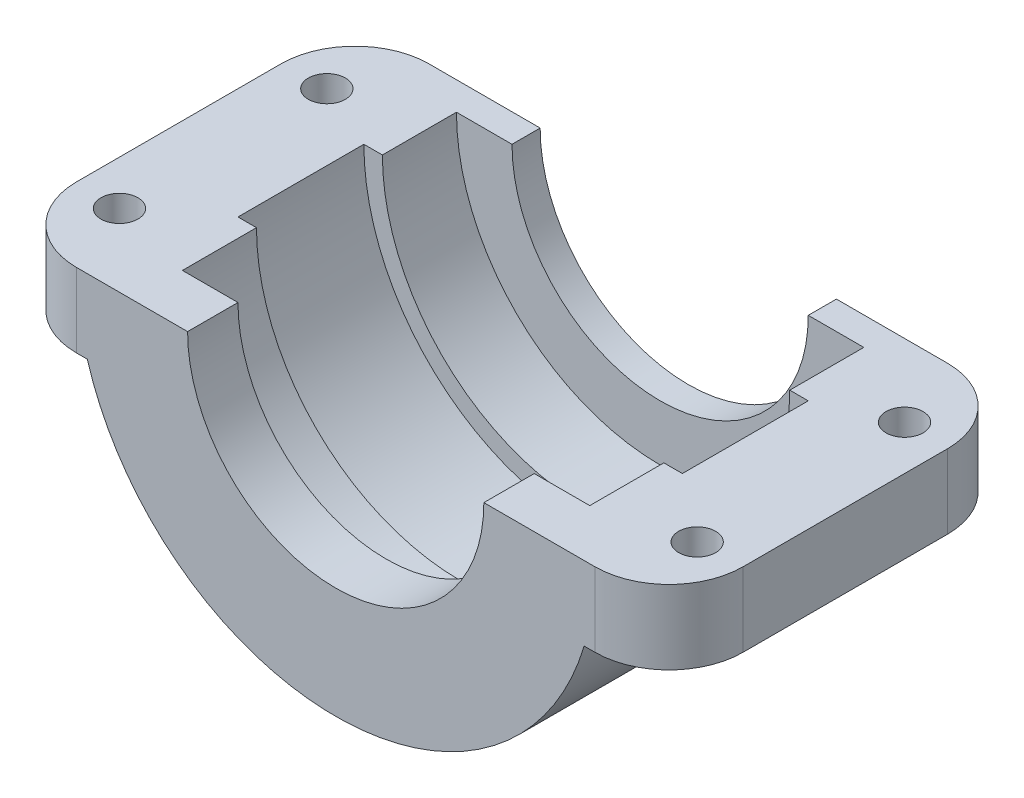
ISO-10303-21;
HEADER;
FILE_DESCRIPTION(('STEP AP214'),'2;1');
FILE_NAME('part.step','',(''),(''),'','','');
FILE_SCHEMA(('AUTOMOTIVE_DESIGN { 1 0 10303 214 1 1 1 1 }'));
ENDSEC;
DATA;
#1=APPLICATION_CONTEXT('core data for automotive mechanical design processes');
#2=APPLICATION_PROTOCOL_DEFINITION('international standard','automotive_design',2000,#1);
#3=PRODUCT_CONTEXT('',#1,'mechanical');
#4=PRODUCT('Part','Part','',(#3));
#5=PRODUCT_RELATED_PRODUCT_CATEGORY('part','',(#4));
#6=PRODUCT_DEFINITION_FORMATION('','',#4);
#7=PRODUCT_DEFINITION_CONTEXT('part definition',#1,'design');
#8=PRODUCT_DEFINITION('design','',#6,#7);
#9=PRODUCT_DEFINITION_SHAPE('','',#8);
#10=(LENGTH_UNIT() NAMED_UNIT(*) SI_UNIT(.MILLI.,.METRE.));
#11=(NAMED_UNIT(*) PLANE_ANGLE_UNIT() SI_UNIT($,.RADIAN.));
#12=(NAMED_UNIT(*) SI_UNIT($,.STERADIAN.) SOLID_ANGLE_UNIT());
#13=UNCERTAINTY_MEASURE_WITH_UNIT(LENGTH_MEASURE(1.E-05),#10,'distance_accuracy_value','');
#14=(GEOMETRIC_REPRESENTATION_CONTEXT(3) GLOBAL_UNCERTAINTY_ASSIGNED_CONTEXT((#13)) GLOBAL_UNIT_ASSIGNED_CONTEXT((#10,
#11,#12)) REPRESENTATION_CONTEXT('',''));
#15=CARTESIAN_POINT('',(0.,0.,0.));
#16=DIRECTION('',(0.,0.,1.));
#17=DIRECTION('',(1.,0.,0.));
#18=AXIS2_PLACEMENT_3D('',#15,#16,#17);
#19=CARTESIAN_POINT('',(0.,0.,3.8));
#20=DIRECTION('',(0.,0.,1.));
#21=DIRECTION('',(1.,0.,0.));
#22=AXIS2_PLACEMENT_3D('',#19,#20,#21);
#23=CYLINDRICAL_SURFACE('',#22,27.5);
#24=CARTESIAN_POINT('',(0.,0.,30.8));
#25=DIRECTION('',(0.,0.,-1.));
#26=DIRECTION('',(-1.,0.,0.));
#27=AXIS2_PLACEMENT_3D('',#24,#25,#26);
#28=CIRCLE('',#27,27.5);
#29=CARTESIAN_POINT('',(-27.5,0.,30.8));
#30=VERTEX_POINT('',#29);
#31=CARTESIAN_POINT('',(27.5,0.,30.8));
#32=VERTEX_POINT('',#31);
#33=EDGE_CURVE('E332',#30,#32,#28,.F.);
#34=ORIENTED_EDGE('',*,*,#33,.F.);
#35=DIRECTION('',(0.,0.,1.));
#36=VECTOR('',#35,1.);
#37=CARTESIAN_POINT('',(-27.5,0.,3.8));
#38=LINE('',#37,#36);
#39=CARTESIAN_POINT('',(-27.5,0.,40.8));
#40=VERTEX_POINT('',#39);
#41=EDGE_CURVE('E189',#40,#30,#38,.F.);
#42=ORIENTED_EDGE('',*,*,#41,.F.);
#43=CARTESIAN_POINT('',(0.,0.,40.8));
#44=DIRECTION('',(0.,0.,1.));
#45=DIRECTION('',(1.,0.,0.));
#46=AXIS2_PLACEMENT_3D('',#43,#44,#45);
#47=CIRCLE('',#46,27.5);
#48=CARTESIAN_POINT('',(27.5,0.,40.8));
#49=VERTEX_POINT('',#48);
#50=EDGE_CURVE('E180',#40,#49,#47,.T.);
#51=ORIENTED_EDGE('',*,*,#50,.T.);
#52=DIRECTION('',(0.,0.,1.));
#53=VECTOR('',#52,1.);
#54=CARTESIAN_POINT('',(27.5,0.,3.8));
#55=LINE('',#54,#53);
#56=EDGE_CURVE('E328',#32,#49,#55,.T.);
#57=ORIENTED_EDGE('',*,*,#56,.F.);
#58=EDGE_LOOP('',(#34,#42,#51,#57));
#59=FACE_BOUND('',#58,.T.);
#60=ADVANCED_FACE('F33',(#59),#23,.F.);
#61=CARTESIAN_POINT('',(-35.,0.,0.));
#62=DIRECTION('',(0.,-1.,0.));
#63=DIRECTION('',(0.,0.,-1.));
#64=AXIS2_PLACEMENT_3D('',#61,#62,#63);
#65=PLANE('',#64);
#66=CARTESIAN_POINT('',(-39.,0.,9.79999999999998));
#67=DIRECTION('',(0.,1.,0.));
#68=DIRECTION('',(0.,0.,-1.));
#69=AXIS2_PLACEMENT_3D('',#66,#67,#68);
#70=CIRCLE('',#69,2.5);
#71=CARTESIAN_POINT('',(-39.,0.,7.29999999999997));
#72=VERTEX_POINT('',#71);
#73=EDGE_CURVE('E217',#72,#72,#70,.T.);
#74=ORIENTED_EDGE('',*,*,#73,.F.);
#75=EDGE_LOOP('',(#74));
#76=FACE_BOUND('',#75,.T.);
#77=CARTESIAN_POINT('',(-39.,0.,37.8));
#78=DIRECTION('',(0.,1.,0.));
#79=DIRECTION('',(0.,0.,1.));
#80=AXIS2_PLACEMENT_3D('',#77,#78,#79);
#81=CIRCLE('',#80,2.5);
#82=CARTESIAN_POINT('',(-39.,0.,40.3));
#83=VERTEX_POINT('',#82);
#84=EDGE_CURVE('E223',#83,#83,#81,.T.);
#85=ORIENTED_EDGE('',*,*,#84,.F.);
#86=EDGE_LOOP('',(#85));
#87=FACE_BOUND('',#86,.T.);
#88=DIRECTION('',(0.,0.,1.));
#89=VECTOR('',#88,1.);
#90=CARTESIAN_POINT('',(-30.,0.,13.8));
#91=LINE('',#90,#89);
#92=CARTESIAN_POINT('',(-30.,0.,13.8));
#93=VERTEX_POINT('',#92);
#94=CARTESIAN_POINT('',(-30.,0.,30.8));
#95=VERTEX_POINT('',#94);
#96=EDGE_CURVE('E172',#93,#95,#91,.T.);
#97=ORIENTED_EDGE('',*,*,#96,.F.);
#98=DIRECTION('',(1.,0.,0.));
#99=VECTOR('',#98,1.);
#100=CARTESIAN_POINT('',(-35.,0.,13.8));
#101=LINE('',#100,#99);
#102=CARTESIAN_POINT('',(-27.5,0.,13.8));
#103=VERTEX_POINT('',#102);
#104=EDGE_CURVE('E181',#93,#103,#101,.T.);
#105=ORIENTED_EDGE('',*,*,#104,.T.);
#106=CARTESIAN_POINT('',(-27.5,0.,3.8));
#107=VERTEX_POINT('',#106);
#108=EDGE_CURVE('E211',#103,#107,#38,.F.);
#109=ORIENTED_EDGE('',*,*,#108,.T.);
#110=DIRECTION('',(-1.,0.,0.));
#111=VECTOR('',#110,1.);
#112=CARTESIAN_POINT('',(-35.,0.,3.8));
#113=LINE('',#112,#111);
#114=CARTESIAN_POINT('',(-20.,0.,3.8));
#115=VERTEX_POINT('',#114);
#116=EDGE_CURVE('E208',#115,#107,#113,.T.);
#117=ORIENTED_EDGE('',*,*,#116,.F.);
#118=DIRECTION('',(0.,0.,-1.));
#119=VECTOR('',#118,1.);
#120=CARTESIAN_POINT('',(-20.,0.,47.6));
#121=LINE('',#120,#119);
#122=CARTESIAN_POINT('',(-20.,0.,0.));
#123=VERTEX_POINT('',#122);
#124=EDGE_CURVE('E284',#115,#123,#121,.T.);
#125=ORIENTED_EDGE('',*,*,#124,.T.);
#126=DIRECTION('',(1.,0.,0.));
#127=VECTOR('',#126,1.);
#128=CARTESIAN_POINT('',(-35.,0.,0.));
#129=LINE('',#128,#127);
#130=CARTESIAN_POINT('',(-35.,0.,0.));
#131=VERTEX_POINT('',#130);
#132=EDGE_CURVE('E260',#131,#123,#129,.T.);
#133=ORIENTED_EDGE('',*,*,#132,.F.);
#134=CARTESIAN_POINT('',(-35.,0.,10.));
#135=DIRECTION('',(0.,-1.,0.));
#136=DIRECTION('',(0.,0.,-1.));
#137=AXIS2_PLACEMENT_3D('',#134,#135,#136);
#138=CIRCLE('',#137,10.);
#139=CARTESIAN_POINT('',(-45.,0.,10.));
#140=VERTEX_POINT('',#139);
#141=EDGE_CURVE('E303',#131,#140,#138,.F.);
#142=ORIENTED_EDGE('',*,*,#141,.T.);
#143=DIRECTION('',(0.,0.,1.));
#144=VECTOR('',#143,1.);
#145=CARTESIAN_POINT('',(-45.,0.,0.));
#146=LINE('',#145,#144);
#147=CARTESIAN_POINT('',(-45.,0.,37.6));
#148=VERTEX_POINT('',#147);
#149=EDGE_CURVE('E242',#140,#148,#146,.T.);
#150=ORIENTED_EDGE('',*,*,#149,.T.);
#151=CARTESIAN_POINT('',(-35.,0.,37.6));
#152=DIRECTION('',(0.,-1.,0.));
#153=DIRECTION('',(0.,0.,-1.));
#154=AXIS2_PLACEMENT_3D('',#151,#152,#153);
#155=CIRCLE('',#154,10.);
#156=CARTESIAN_POINT('',(-35.,0.,47.6));
#157=VERTEX_POINT('',#156);
#158=EDGE_CURVE('E305',#148,#157,#155,.F.);
#159=ORIENTED_EDGE('',*,*,#158,.T.);
#160=DIRECTION('',(1.,0.,0.));
#161=VECTOR('',#160,1.);
#162=CARTESIAN_POINT('',(-35.,0.,47.6));
#163=LINE('',#162,#161);
#164=CARTESIAN_POINT('',(-20.,0.,47.6));
#165=VERTEX_POINT('',#164);
#166=EDGE_CURVE('E265',#157,#165,#163,.T.);
#167=ORIENTED_EDGE('',*,*,#166,.T.);
#168=CARTESIAN_POINT('',(-20.,0.,40.8));
#169=VERTEX_POINT('',#168);
#170=EDGE_CURVE('E285',#165,#169,#121,.T.);
#171=ORIENTED_EDGE('',*,*,#170,.T.);
#172=DIRECTION('',(-1.,0.,0.));
#173=VECTOR('',#172,1.);
#174=CARTESIAN_POINT('',(-35.,0.,40.8));
#175=LINE('',#174,#173);
#176=EDGE_CURVE('E56',#169,#40,#175,.T.);
#177=ORIENTED_EDGE('',*,*,#176,.T.);
#178=ORIENTED_EDGE('',*,*,#41,.T.);
#179=DIRECTION('',(1.,0.,0.));
#180=VECTOR('',#179,1.);
#181=CARTESIAN_POINT('',(-35.,0.,30.8));
#182=LINE('',#181,#180);
#183=EDGE_CURVE('E48',#95,#30,#182,.T.);
#184=ORIENTED_EDGE('',*,*,#183,.F.);
#185=EDGE_LOOP('',(#97,#105,#109,#117,#125,#133,#142,#150,#159,#167,#171,#177,#178,#184));
#186=FACE_BOUND('',#185,.T.);
#187=ADVANCED_FACE('F188',(#76,#87,#186),#65,.F.);
#188=CARTESIAN_POINT('',(39.,0.,9.8));
#189=DIRECTION('',(0.,1.,0.));
#190=DIRECTION('',(0.,0.,1.));
#191=AXIS2_PLACEMENT_3D('',#188,#189,#190);
#192=CIRCLE('',#191,2.5);
#193=CARTESIAN_POINT('',(39.,0.,12.3));
#194=VERTEX_POINT('',#193);
#195=EDGE_CURVE('E231',#194,#194,#192,.T.);
#196=ORIENTED_EDGE('',*,*,#195,.F.);
#197=EDGE_LOOP('',(#196));
#198=FACE_BOUND('',#197,.T.);
#199=CARTESIAN_POINT('',(39.,0.,37.8));
#200=DIRECTION('',(0.,1.,0.));
#201=DIRECTION('',(0.,0.,-1.));
#202=AXIS2_PLACEMENT_3D('',#199,#200,#201);
#203=CIRCLE('',#202,2.5);
#204=CARTESIAN_POINT('',(39.,0.,35.3));
#205=VERTEX_POINT('',#204);
#206=EDGE_CURVE('E227',#205,#205,#203,.T.);
#207=ORIENTED_EDGE('',*,*,#206,.F.);
#208=EDGE_LOOP('',(#207));
#209=FACE_BOUND('',#208,.T.);
#210=CARTESIAN_POINT('',(27.5,0.,3.8));
#211=VERTEX_POINT('',#210);
#212=CARTESIAN_POINT('',(27.5,0.,13.8));
#213=VERTEX_POINT('',#212);
#214=EDGE_CURVE('E329',#211,#213,#55,.T.);
#215=ORIENTED_EDGE('',*,*,#214,.T.);
#216=DIRECTION('',(1.,0.,0.));
#217=VECTOR('',#216,1.);
#218=CARTESIAN_POINT('',(-35.,0.,13.8));
#219=LINE('',#218,#217);
#220=CARTESIAN_POINT('',(30.,0.,13.8));
#221=VERTEX_POINT('',#220);
#222=EDGE_CURVE('E190',#213,#221,#219,.T.);
#223=ORIENTED_EDGE('',*,*,#222,.T.);
#224=DIRECTION('',(0.,0.,1.));
#225=VECTOR('',#224,1.);
#226=CARTESIAN_POINT('',(30.,0.,13.8));
#227=LINE('',#226,#225);
#228=CARTESIAN_POINT('',(30.,0.,30.8));
#229=VERTEX_POINT('',#228);
#230=EDGE_CURVE('E11',#229,#221,#227,.F.);
#231=ORIENTED_EDGE('',*,*,#230,.F.);
#232=DIRECTION('',(1.,0.,0.));
#233=VECTOR('',#232,1.);
#234=CARTESIAN_POINT('',(-35.,0.,30.8));
#235=LINE('',#234,#233);
#236=EDGE_CURVE('E185',#32,#229,#235,.T.);
#237=ORIENTED_EDGE('',*,*,#236,.F.);
#238=ORIENTED_EDGE('',*,*,#56,.T.);
#239=DIRECTION('',(-1.,0.,0.));
#240=VECTOR('',#239,1.);
#241=CARTESIAN_POINT('',(-35.,0.,40.8));
#242=LINE('',#241,#240);
#243=CARTESIAN_POINT('',(20.,0.,40.8));
#244=VERTEX_POINT('',#243);
#245=EDGE_CURVE('E200',#49,#244,#242,.T.);
#246=ORIENTED_EDGE('',*,*,#245,.T.);
#247=DIRECTION('',(0.,0.,-1.));
#248=VECTOR('',#247,1.);
#249=CARTESIAN_POINT('',(20.,0.,47.6));
#250=LINE('',#249,#248);
#251=CARTESIAN_POINT('',(20.,0.,47.6));
#252=VERTEX_POINT('',#251);
#253=EDGE_CURVE('E270',#244,#252,#250,.F.);
#254=ORIENTED_EDGE('',*,*,#253,.T.);
#255=CARTESIAN_POINT('',(35.,0.,47.6));
#256=VERTEX_POINT('',#255);
#257=EDGE_CURVE('E259',#252,#256,#163,.T.);
#258=ORIENTED_EDGE('',*,*,#257,.T.);
#259=CARTESIAN_POINT('',(35.,0.,37.6));
#260=DIRECTION('',(0.,-1.,0.));
#261=DIRECTION('',(0.,0.,-1.));
#262=AXIS2_PLACEMENT_3D('',#259,#260,#261);
#263=CIRCLE('',#262,10.);
#264=CARTESIAN_POINT('',(45.,0.,37.6));
#265=VERTEX_POINT('',#264);
#266=EDGE_CURVE('E313',#256,#265,#263,.F.);
#267=ORIENTED_EDGE('',*,*,#266,.T.);
#268=DIRECTION('',(0.,0.,1.));
#269=VECTOR('',#268,1.);
#270=CARTESIAN_POINT('',(45.,0.,0.));
#271=LINE('',#270,#269);
#272=CARTESIAN_POINT('',(45.,0.,10.));
#273=VERTEX_POINT('',#272);
#274=EDGE_CURVE('E246',#273,#265,#271,.T.);
#275=ORIENTED_EDGE('',*,*,#274,.F.);
#276=CARTESIAN_POINT('',(35.,0.,10.));
#277=DIRECTION('',(0.,-1.,0.));
#278=DIRECTION('',(0.,0.,-1.));
#279=AXIS2_PLACEMENT_3D('',#276,#277,#278);
#280=CIRCLE('',#279,10.);
#281=CARTESIAN_POINT('',(35.,0.,0.));
#282=VERTEX_POINT('',#281);
#283=EDGE_CURVE('E311',#273,#282,#280,.F.);
#284=ORIENTED_EDGE('',*,*,#283,.T.);
#285=CARTESIAN_POINT('',(20.,0.,0.));
#286=VERTEX_POINT('',#285);
#287=EDGE_CURVE('E264',#286,#282,#129,.T.);
#288=ORIENTED_EDGE('',*,*,#287,.F.);
#289=CARTESIAN_POINT('',(20.,0.,3.8));
#290=VERTEX_POINT('',#289);
#291=EDGE_CURVE('E281',#286,#290,#250,.F.);
#292=ORIENTED_EDGE('',*,*,#291,.T.);
#293=DIRECTION('',(-1.,0.,0.));
#294=VECTOR('',#293,1.);
#295=CARTESIAN_POINT('',(-35.,0.,3.8));
#296=LINE('',#295,#294);
#297=EDGE_CURVE('E206',#211,#290,#296,.T.);
#298=ORIENTED_EDGE('',*,*,#297,.F.);
#299=EDGE_LOOP('',(#215,#223,#231,#237,#238,#246,#254,#258,#267,#275,#284,#288,#292,#298));
#300=FACE_BOUND('',#299,.T.);
#301=ADVANCED_FACE('F341',(#198,#209,#300),#65,.F.);
#302=CARTESIAN_POINT('',(0.,0.,47.6));
#303=DIRECTION('',(0.,0.,-1.));
#304=DIRECTION('',(-1.,0.,0.));
#305=AXIS2_PLACEMENT_3D('',#302,#303,#304);
#306=CYLINDRICAL_SURFACE('',#305,20.);
#307=CARTESIAN_POINT('',(0.,0.,3.8));
#308=DIRECTION('',(0.,0.,1.));
#309=DIRECTION('',(1.,0.,0.));
#310=AXIS2_PLACEMENT_3D('',#307,#308,#309);
#311=CIRCLE('',#310,20.);
#312=EDGE_CURVE('E326',#290,#115,#311,.F.);
#313=ORIENTED_EDGE('',*,*,#312,.F.);
#314=ORIENTED_EDGE('',*,*,#291,.F.);
#315=CARTESIAN_POINT('',(0.,0.,0.));
#316=DIRECTION('',(0.,0.,-1.));
#317=DIRECTION('',(-1.,0.,0.));
#318=AXIS2_PLACEMENT_3D('',#315,#316,#317);
#319=CIRCLE('',#318,20.);
#320=EDGE_CURVE('E213',#286,#123,#319,.T.);
#321=ORIENTED_EDGE('',*,*,#320,.T.);
#322=ORIENTED_EDGE('',*,*,#124,.F.);
#323=EDGE_LOOP('',(#313,#314,#321,#322));
#324=FACE_BOUND('',#323,.T.);
#325=ADVANCED_FACE('F349',(#324),#306,.F.);
#326=CARTESIAN_POINT('',(0.,0.,47.6));
#327=DIRECTION('',(0.,0.,-1.));
#328=DIRECTION('',(-1.,0.,0.));
#329=AXIS2_PLACEMENT_3D('',#326,#327,#328);
#330=CYLINDRICAL_SURFACE('',#329,35.);
#331=CARTESIAN_POINT('',(0.,0.,47.6));
#332=DIRECTION('',(0.,0.,1.));
#333=DIRECTION('',(1.,0.,0.));
#334=AXIS2_PLACEMENT_3D('',#331,#332,#333);
#335=CIRCLE('',#334,35.);
#336=CARTESIAN_POINT('',(-33.5410196624969,-10.,47.6));
#337=VERTEX_POINT('',#336);
#338=CARTESIAN_POINT('',(33.5410196624968,-10.,47.6));
#339=VERTEX_POINT('',#338);
#340=EDGE_CURVE('E267',#337,#339,#335,.T.);
#341=ORIENTED_EDGE('',*,*,#340,.F.);
#342=DIRECTION('',(0.,0.,-1.));
#343=VECTOR('',#342,1.);
#344=CARTESIAN_POINT('',(-33.5410196624969,-9.99999999999999,47.6));
#345=LINE('',#344,#343);
#346=CARTESIAN_POINT('',(-33.5410196624969,-10.,0.));
#347=VERTEX_POINT('',#346);
#348=EDGE_CURVE('E256',#337,#347,#345,.T.);
#349=ORIENTED_EDGE('',*,*,#348,.T.);
#350=CARTESIAN_POINT('',(0.,0.,0.));
#351=DIRECTION('',(0.,0.,1.));
#352=DIRECTION('',(1.,0.,0.));
#353=AXIS2_PLACEMENT_3D('',#350,#351,#352);
#354=CIRCLE('',#353,35.);
#355=CARTESIAN_POINT('',(33.5410196624968,-10.,0.));
#356=VERTEX_POINT('',#355);
#357=EDGE_CURVE('E263',#347,#356,#354,.T.);
#358=ORIENTED_EDGE('',*,*,#357,.T.);
#359=DIRECTION('',(0.,0.,-1.));
#360=VECTOR('',#359,1.);
#361=CARTESIAN_POINT('',(33.5410196624969,-9.99999999999999,47.6));
#362=LINE('',#361,#360);
#363=EDGE_CURVE('E245',#356,#339,#362,.F.);
#364=ORIENTED_EDGE('',*,*,#363,.T.);
#365=EDGE_LOOP('',(#341,#349,#358,#364));
#366=FACE_BOUND('',#365,.T.);
#367=ADVANCED_FACE('F425',(#366),#330,.T.);
#368=CARTESIAN_POINT('',(0.,0.,47.6));
#369=DIRECTION('',(0.,0.,1.));
#370=DIRECTION('',(1.,0.,0.));
#371=AXIS2_PLACEMENT_3D('',#368,#369,#370);
#372=PLANE('',#371);
#373=ORIENTED_EDGE('',*,*,#166,.F.);
#374=DIRECTION('',(0.,-1.,0.));
#375=VECTOR('',#374,1.);
#376=CARTESIAN_POINT('',(-35.,0.,47.6));
#377=LINE('',#376,#375);
#378=CARTESIAN_POINT('',(-35.,-10.,47.6));
#379=VERTEX_POINT('',#378);
#380=EDGE_CURVE('E291',#157,#379,#377,.T.);
#381=ORIENTED_EDGE('',*,*,#380,.T.);
#382=DIRECTION('',(1.,0.,0.));
#383=VECTOR('',#382,1.);
#384=CARTESIAN_POINT('',(-45.,-10.,47.6));
#385=LINE('',#384,#383);
#386=EDGE_CURVE('E239',#379,#337,#385,.T.);
#387=ORIENTED_EDGE('',*,*,#386,.T.);
#388=ORIENTED_EDGE('',*,*,#340,.T.);
#389=CARTESIAN_POINT('',(35.,-10.,47.6));
#390=VERTEX_POINT('',#389);
#391=EDGE_CURVE('E241',#339,#390,#385,.T.);
#392=ORIENTED_EDGE('',*,*,#391,.T.);
#393=DIRECTION('',(0.,1.,0.));
#394=VECTOR('',#393,1.);
#395=CARTESIAN_POINT('',(35.,0.,47.6));
#396=LINE('',#395,#394);
#397=EDGE_CURVE('E288',#390,#256,#396,.T.);
#398=ORIENTED_EDGE('',*,*,#397,.T.);
#399=ORIENTED_EDGE('',*,*,#257,.F.);
#400=CARTESIAN_POINT('',(0.,0.,47.6));
#401=DIRECTION('',(0.,0.,-1.));
#402=DIRECTION('',(-1.,0.,0.));
#403=AXIS2_PLACEMENT_3D('',#400,#401,#402);
#404=CIRCLE('',#403,20.);
#405=EDGE_CURVE('E214',#252,#165,#404,.T.);
#406=ORIENTED_EDGE('',*,*,#405,.T.);
#407=EDGE_LOOP('',(#373,#381,#387,#388,#392,#398,#399,#406));
#408=FACE_BOUND('',#407,.T.);
#409=ADVANCED_FACE('F374',(#408),#372,.T.);
#410=CARTESIAN_POINT('',(0.,0.,0.));
#411=DIRECTION('',(0.,0.,1.));
#412=DIRECTION('',(1.,0.,0.));
#413=AXIS2_PLACEMENT_3D('',#410,#411,#412);
#414=PLANE('',#413);
#415=DIRECTION('',(1.,0.,0.));
#416=VECTOR('',#415,1.);
#417=CARTESIAN_POINT('',(-45.,-10.,0.));
#418=LINE('',#417,#416);
#419=CARTESIAN_POINT('',(-35.,-10.,0.));
#420=VERTEX_POINT('',#419);
#421=EDGE_CURVE('E235',#420,#347,#418,.T.);
#422=ORIENTED_EDGE('',*,*,#421,.F.);
#423=DIRECTION('',(0.,-1.,0.));
#424=VECTOR('',#423,1.);
#425=CARTESIAN_POINT('',(-35.,0.,0.));
#426=LINE('',#425,#424);
#427=EDGE_CURVE('E309',#420,#131,#426,.F.);
#428=ORIENTED_EDGE('',*,*,#427,.T.);
#429=ORIENTED_EDGE('',*,*,#132,.T.);
#430=ORIENTED_EDGE('',*,*,#320,.F.);
#431=ORIENTED_EDGE('',*,*,#287,.T.);
#432=DIRECTION('',(0.,1.,0.));
#433=VECTOR('',#432,1.);
#434=CARTESIAN_POINT('',(35.,-10.,0.));
#435=LINE('',#434,#433);
#436=CARTESIAN_POINT('',(35.,-10.,0.));
#437=VERTEX_POINT('',#436);
#438=EDGE_CURVE('E307',#282,#437,#435,.F.);
#439=ORIENTED_EDGE('',*,*,#438,.T.);
#440=EDGE_CURVE('E238',#356,#437,#418,.T.);
#441=ORIENTED_EDGE('',*,*,#440,.F.);
#442=ORIENTED_EDGE('',*,*,#357,.F.);
#443=EDGE_LOOP('',(#422,#428,#429,#430,#431,#439,#441,#442));
#444=FACE_BOUND('',#443,.T.);
#445=ADVANCED_FACE('F355',(#444),#414,.F.);
#446=CARTESIAN_POINT('',(45.,0.,0.));
#447=DIRECTION('',(1.,0.,0.));
#448=DIRECTION('',(0.,0.,-1.));
#449=AXIS2_PLACEMENT_3D('',#446,#447,#448);
#450=PLANE('',#449);
#451=ORIENTED_EDGE('',*,*,#274,.T.);
#452=DIRECTION('',(0.,1.,0.));
#453=VECTOR('',#452,1.);
#454=CARTESIAN_POINT('',(45.,0.,37.6));
#455=LINE('',#454,#453);
#456=CARTESIAN_POINT('',(45.,-10.,37.6));
#457=VERTEX_POINT('',#456);
#458=EDGE_CURVE('E318',#265,#457,#455,.F.);
#459=ORIENTED_EDGE('',*,*,#458,.T.);
#460=DIRECTION('',(0.,0.,1.));
#461=VECTOR('',#460,1.);
#462=CARTESIAN_POINT('',(45.,-10.,0.));
#463=LINE('',#462,#461);
#464=CARTESIAN_POINT('',(45.,-10.,10.));
#465=VERTEX_POINT('',#464);
#466=EDGE_CURVE('E249',#465,#457,#463,.T.);
#467=ORIENTED_EDGE('',*,*,#466,.F.);
#468=DIRECTION('',(0.,1.,0.));
#469=VECTOR('',#468,1.);
#470=CARTESIAN_POINT('',(45.,0.,10.));
#471=LINE('',#470,#469);
#472=EDGE_CURVE('E315',#465,#273,#471,.T.);
#473=ORIENTED_EDGE('',*,*,#472,.T.);
#474=EDGE_LOOP('',(#451,#459,#467,#473));
#475=FACE_BOUND('',#474,.T.);
#476=ADVANCED_FACE('F417',(#475),#450,.T.);
#477=CARTESIAN_POINT('',(-45.,-10.,0.));
#478=DIRECTION('',(0.,-1.,0.));
#479=DIRECTION('',(0.,0.,-1.));
#480=AXIS2_PLACEMENT_3D('',#477,#478,#479);
#481=PLANE('',#480);
#482=CARTESIAN_POINT('',(39.,-10.,37.8));
#483=DIRECTION('',(0.,-1.,0.));
#484=DIRECTION('',(0.,0.,-1.));
#485=AXIS2_PLACEMENT_3D('',#482,#483,#484);
#486=CIRCLE('',#485,2.5);
#487=CARTESIAN_POINT('',(39.,-10.,35.3));
#488=VERTEX_POINT('',#487);
#489=EDGE_CURVE('E230',#488,#488,#486,.T.);
#490=ORIENTED_EDGE('',*,*,#489,.F.);
#491=EDGE_LOOP('',(#490));
#492=FACE_BOUND('',#491,.T.);
#493=CARTESIAN_POINT('',(39.,-10.,9.8));
#494=DIRECTION('',(0.,-1.,0.));
#495=DIRECTION('',(0.,0.,-1.));
#496=AXIS2_PLACEMENT_3D('',#493,#494,#495);
#497=CIRCLE('',#496,2.5);
#498=CARTESIAN_POINT('',(39.,-10.,7.3));
#499=VERTEX_POINT('',#498);
#500=EDGE_CURVE('E234',#499,#499,#497,.T.);
#501=ORIENTED_EDGE('',*,*,#500,.F.);
#502=EDGE_LOOP('',(#501));
#503=FACE_BOUND('',#502,.T.);
#504=ORIENTED_EDGE('',*,*,#466,.T.);
#505=CARTESIAN_POINT('',(35.,-10.,37.6));
#506=DIRECTION('',(0.,-1.,0.));
#507=DIRECTION('',(0.,0.,-1.));
#508=AXIS2_PLACEMENT_3D('',#505,#506,#507);
#509=CIRCLE('',#508,10.);
#510=EDGE_CURVE('E322',#457,#390,#509,.T.);
#511=ORIENTED_EDGE('',*,*,#510,.T.);
#512=ORIENTED_EDGE('',*,*,#391,.F.);
#513=ORIENTED_EDGE('',*,*,#363,.F.);
#514=ORIENTED_EDGE('',*,*,#440,.T.);
#515=CARTESIAN_POINT('',(35.,-10.,10.));
#516=DIRECTION('',(0.,-1.,0.));
#517=DIRECTION('',(0.,0.,-1.));
#518=AXIS2_PLACEMENT_3D('',#515,#516,#517);
#519=CIRCLE('',#518,10.);
#520=EDGE_CURVE('E320',#437,#465,#519,.T.);
#521=ORIENTED_EDGE('',*,*,#520,.T.);
#522=EDGE_LOOP('',(#504,#511,#512,#513,#514,#521));
#523=FACE_BOUND('',#522,.T.);
#524=ADVANCED_FACE('F413',(#492,#503,#523),#481,.T.);
#525=CARTESIAN_POINT('',(-39.,-10.,9.79999999999998));
#526=DIRECTION('',(0.,-1.,0.));
#527=DIRECTION('',(0.,0.,-1.));
#528=AXIS2_PLACEMENT_3D('',#525,#526,#527);
#529=CIRCLE('',#528,2.5);
#530=CARTESIAN_POINT('',(-39.,-10.,7.29999999999997));
#531=VERTEX_POINT('',#530);
#532=EDGE_CURVE('E222',#531,#531,#529,.T.);
#533=ORIENTED_EDGE('',*,*,#532,.F.);
#534=EDGE_LOOP('',(#533));
#535=FACE_BOUND('',#534,.T.);
#536=CARTESIAN_POINT('',(-39.,-10.,37.8));
#537=DIRECTION('',(0.,-1.,0.));
#538=DIRECTION('',(0.,0.,-1.));
#539=AXIS2_PLACEMENT_3D('',#536,#537,#538);
#540=CIRCLE('',#539,2.5);
#541=CARTESIAN_POINT('',(-39.,-10.,35.3));
#542=VERTEX_POINT('',#541);
#543=EDGE_CURVE('E226',#542,#542,#540,.T.);
#544=ORIENTED_EDGE('',*,*,#543,.F.);
#545=EDGE_LOOP('',(#544));
#546=FACE_BOUND('',#545,.T.);
#547=ORIENTED_EDGE('',*,*,#386,.F.);
#548=CARTESIAN_POINT('',(-35.,-10.,37.6));
#549=DIRECTION('',(0.,-1.,0.));
#550=DIRECTION('',(0.,0.,-1.));
#551=AXIS2_PLACEMENT_3D('',#548,#549,#550);
#552=CIRCLE('',#551,10.);
#553=CARTESIAN_POINT('',(-45.,-10.,37.6));
#554=VERTEX_POINT('',#553);
#555=EDGE_CURVE('E296',#379,#554,#552,.T.);
#556=ORIENTED_EDGE('',*,*,#555,.T.);
#557=DIRECTION('',(0.,0.,1.));
#558=VECTOR('',#557,1.);
#559=CARTESIAN_POINT('',(-45.,-10.,0.));
#560=LINE('',#559,#558);
#561=CARTESIAN_POINT('',(-45.,-10.,10.));
#562=VERTEX_POINT('',#561);
#563=EDGE_CURVE('E237',#562,#554,#560,.T.);
#564=ORIENTED_EDGE('',*,*,#563,.F.);
#565=CARTESIAN_POINT('',(-35.,-10.,10.));
#566=DIRECTION('',(0.,-1.,0.));
#567=DIRECTION('',(0.,0.,-1.));
#568=AXIS2_PLACEMENT_3D('',#565,#566,#567);
#569=CIRCLE('',#568,10.);
#570=EDGE_CURVE('E294',#562,#420,#569,.T.);
#571=ORIENTED_EDGE('',*,*,#570,.T.);
#572=ORIENTED_EDGE('',*,*,#421,.T.);
#573=ORIENTED_EDGE('',*,*,#348,.F.);
#574=EDGE_LOOP('',(#547,#556,#564,#571,#572,#573));
#575=FACE_BOUND('',#574,.T.);
#576=ADVANCED_FACE('F427',(#535,#546,#575),#481,.T.);
#577=CARTESIAN_POINT('',(-45.,0.,0.));
#578=DIRECTION('',(-1.,0.,0.));
#579=DIRECTION('',(0.,0.,1.));
#580=AXIS2_PLACEMENT_3D('',#577,#578,#579);
#581=PLANE('',#580);
#582=ORIENTED_EDGE('',*,*,#563,.T.);
#583=DIRECTION('',(0.,-1.,0.));
#584=VECTOR('',#583,1.);
#585=CARTESIAN_POINT('',(-45.,0.,37.6));
#586=LINE('',#585,#584);
#587=EDGE_CURVE('E301',#554,#148,#586,.F.);
#588=ORIENTED_EDGE('',*,*,#587,.T.);
#589=ORIENTED_EDGE('',*,*,#149,.F.);
#590=DIRECTION('',(0.,-1.,0.));
#591=VECTOR('',#590,1.);
#592=CARTESIAN_POINT('',(-45.,-10.,10.));
#593=LINE('',#592,#591);
#594=EDGE_CURVE('E298',#140,#562,#593,.T.);
#595=ORIENTED_EDGE('',*,*,#594,.T.);
#596=EDGE_LOOP('',(#582,#588,#589,#595));
#597=FACE_BOUND('',#596,.T.);
#598=ADVANCED_FACE('F365',(#597),#581,.T.);
#599=CARTESIAN_POINT('',(39.,-35.,9.8));
#600=DIRECTION('',(0.,1.,0.));
#601=DIRECTION('',(0.,0.,1.));
#602=AXIS2_PLACEMENT_3D('',#599,#600,#601);
#603=CYLINDRICAL_SURFACE('',#602,2.5);
#604=ORIENTED_EDGE('',*,*,#500,.T.);
#605=EDGE_LOOP('',(#604));
#606=FACE_BOUND('',#605,.T.);
#607=ORIENTED_EDGE('',*,*,#195,.T.);
#608=EDGE_LOOP('',(#607));
#609=FACE_BOUND('',#608,.T.);
#610=ADVANCED_FACE('F435',(#606,#609),#603,.F.);
#611=CARTESIAN_POINT('',(39.,-35.,37.8));
#612=DIRECTION('',(0.,1.,0.));
#613=DIRECTION('',(0.,0.,1.));
#614=AXIS2_PLACEMENT_3D('',#611,#612,#613);
#615=CYLINDRICAL_SURFACE('',#614,2.5);
#616=ORIENTED_EDGE('',*,*,#489,.T.);
#617=EDGE_LOOP('',(#616));
#618=FACE_BOUND('',#617,.T.);
#619=ORIENTED_EDGE('',*,*,#206,.T.);
#620=EDGE_LOOP('',(#619));
#621=FACE_BOUND('',#620,.T.);
#622=ADVANCED_FACE('F557',(#618,#621),#615,.F.);
#623=CARTESIAN_POINT('',(-39.,-35.,37.8));
#624=DIRECTION('',(0.,1.,0.));
#625=DIRECTION('',(0.,0.,1.));
#626=AXIS2_PLACEMENT_3D('',#623,#624,#625);
#627=CYLINDRICAL_SURFACE('',#626,2.5);
#628=ORIENTED_EDGE('',*,*,#543,.T.);
#629=EDGE_LOOP('',(#628));
#630=FACE_BOUND('',#629,.T.);
#631=ORIENTED_EDGE('',*,*,#84,.T.);
#632=EDGE_LOOP('',(#631));
#633=FACE_BOUND('',#632,.T.);
#634=ADVANCED_FACE('F559',(#630,#633),#627,.F.);
#635=CARTESIAN_POINT('',(-39.,-35.,9.79999999999998));
#636=DIRECTION('',(0.,1.,0.));
#637=DIRECTION('',(0.,0.,1.));
#638=AXIS2_PLACEMENT_3D('',#635,#636,#637);
#639=CYLINDRICAL_SURFACE('',#638,2.5);
#640=ORIENTED_EDGE('',*,*,#532,.T.);
#641=EDGE_LOOP('',(#640));
#642=FACE_BOUND('',#641,.T.);
#643=ORIENTED_EDGE('',*,*,#73,.T.);
#644=EDGE_LOOP('',(#643));
#645=FACE_BOUND('',#644,.T.);
#646=ADVANCED_FACE('F482',(#642,#645),#639,.F.);
#647=ORIENTED_EDGE('',*,*,#253,.F.);
#648=CARTESIAN_POINT('',(0.,0.,40.8));
#649=DIRECTION('',(0.,0.,1.));
#650=DIRECTION('',(1.,0.,0.));
#651=AXIS2_PLACEMENT_3D('',#648,#649,#650);
#652=CIRCLE('',#651,20.);
#653=EDGE_CURVE('E324',#244,#169,#652,.F.);
#654=ORIENTED_EDGE('',*,*,#653,.T.);
#655=ORIENTED_EDGE('',*,*,#170,.F.);
#656=ORIENTED_EDGE('',*,*,#405,.F.);
#657=EDGE_LOOP('',(#647,#654,#655,#656));
#658=FACE_BOUND('',#657,.T.);
#659=ADVANCED_FACE('F381',(#658),#306,.F.);
#660=CARTESIAN_POINT('',(-35.,0.,37.6));
#661=DIRECTION('',(0.,-1.,0.));
#662=DIRECTION('',(0.,0.,-1.));
#663=AXIS2_PLACEMENT_3D('',#660,#661,#662);
#664=CYLINDRICAL_SURFACE('',#663,10.);
#665=ORIENTED_EDGE('',*,*,#158,.F.);
#666=ORIENTED_EDGE('',*,*,#587,.F.);
#667=ORIENTED_EDGE('',*,*,#555,.F.);
#668=ORIENTED_EDGE('',*,*,#380,.F.);
#669=EDGE_LOOP('',(#665,#666,#667,#668));
#670=FACE_BOUND('',#669,.T.);
#671=ADVANCED_FACE('F369',(#670),#664,.T.);
#672=CARTESIAN_POINT('',(-35.,0.,10.));
#673=DIRECTION('',(0.,1.,0.));
#674=DIRECTION('',(0.,0.,1.));
#675=AXIS2_PLACEMENT_3D('',#672,#673,#674);
#676=CYLINDRICAL_SURFACE('',#675,10.);
#677=ORIENTED_EDGE('',*,*,#141,.F.);
#678=ORIENTED_EDGE('',*,*,#427,.F.);
#679=ORIENTED_EDGE('',*,*,#570,.F.);
#680=ORIENTED_EDGE('',*,*,#594,.F.);
#681=EDGE_LOOP('',(#677,#678,#679,#680));
#682=FACE_BOUND('',#681,.T.);
#683=ADVANCED_FACE('F360',(#682),#676,.T.);
#684=CARTESIAN_POINT('',(35.,0.,37.6));
#685=DIRECTION('',(0.,1.,0.));
#686=DIRECTION('',(0.,0.,1.));
#687=AXIS2_PLACEMENT_3D('',#684,#685,#686);
#688=CYLINDRICAL_SURFACE('',#687,10.);
#689=ORIENTED_EDGE('',*,*,#510,.F.);
#690=ORIENTED_EDGE('',*,*,#458,.F.);
#691=ORIENTED_EDGE('',*,*,#266,.F.);
#692=ORIENTED_EDGE('',*,*,#397,.F.);
#693=EDGE_LOOP('',(#689,#690,#691,#692));
#694=FACE_BOUND('',#693,.T.);
#695=ADVANCED_FACE('F401',(#694),#688,.T.);
#696=CARTESIAN_POINT('',(35.,0.,10.));
#697=DIRECTION('',(0.,-1.,0.));
#698=DIRECTION('',(0.,0.,-1.));
#699=AXIS2_PLACEMENT_3D('',#696,#697,#698);
#700=CYLINDRICAL_SURFACE('',#699,10.);
#701=ORIENTED_EDGE('',*,*,#520,.F.);
#702=ORIENTED_EDGE('',*,*,#438,.F.);
#703=ORIENTED_EDGE('',*,*,#283,.F.);
#704=ORIENTED_EDGE('',*,*,#472,.F.);
#705=EDGE_LOOP('',(#701,#702,#703,#704));
#706=FACE_BOUND('',#705,.T.);
#707=ADVANCED_FACE('F35',(#706),#700,.T.);
#708=ORIENTED_EDGE('',*,*,#108,.F.);
#709=CARTESIAN_POINT('',(0.,0.,13.8));
#710=DIRECTION('',(0.,0.,-1.));
#711=DIRECTION('',(-1.,0.,0.));
#712=AXIS2_PLACEMENT_3D('',#709,#710,#711);
#713=CIRCLE('',#712,27.5);
#714=EDGE_CURVE('E41',#103,#213,#713,.F.);
#715=ORIENTED_EDGE('',*,*,#714,.T.);
#716=ORIENTED_EDGE('',*,*,#214,.F.);
#717=CARTESIAN_POINT('',(0.,0.,3.8));
#718=DIRECTION('',(0.,0.,1.));
#719=DIRECTION('',(1.,0.,0.));
#720=AXIS2_PLACEMENT_3D('',#717,#718,#719);
#721=CIRCLE('',#720,27.5);
#722=EDGE_CURVE('E197',#107,#211,#721,.T.);
#723=ORIENTED_EDGE('',*,*,#722,.F.);
#724=EDGE_LOOP('',(#708,#715,#716,#723));
#725=FACE_BOUND('',#724,.T.);
#726=ADVANCED_FACE('F336',(#725),#23,.F.);
#727=CARTESIAN_POINT('',(0.,0.,3.8));
#728=DIRECTION('',(0.,0.,1.));
#729=DIRECTION('',(1.,0.,0.));
#730=AXIS2_PLACEMENT_3D('',#727,#728,#729);
#731=PLANE('',#730);
#732=ORIENTED_EDGE('',*,*,#116,.T.);
#733=ORIENTED_EDGE('',*,*,#722,.T.);
#734=ORIENTED_EDGE('',*,*,#297,.T.);
#735=ORIENTED_EDGE('',*,*,#312,.T.);
#736=EDGE_LOOP('',(#732,#733,#734,#735));
#737=FACE_BOUND('',#736,.T.);
#738=ADVANCED_FACE('F345',(#737),#731,.T.);
#739=CARTESIAN_POINT('',(0.,0.,40.8));
#740=DIRECTION('',(0.,0.,1.));
#741=DIRECTION('',(1.,0.,0.));
#742=AXIS2_PLACEMENT_3D('',#739,#740,#741);
#743=PLANE('',#742);
#744=ORIENTED_EDGE('',*,*,#653,.F.);
#745=ORIENTED_EDGE('',*,*,#245,.F.);
#746=ORIENTED_EDGE('',*,*,#50,.F.);
#747=ORIENTED_EDGE('',*,*,#176,.F.);
#748=EDGE_LOOP('',(#744,#745,#746,#747));
#749=FACE_BOUND('',#748,.T.);
#750=ADVANCED_FACE('F383',(#749),#743,.F.);
#751=CARTESIAN_POINT('',(0.,0.,13.8));
#752=DIRECTION('',(0.,0.,1.));
#753=DIRECTION('',(1.,0.,0.));
#754=AXIS2_PLACEMENT_3D('',#751,#752,#753);
#755=CYLINDRICAL_SURFACE('',#754,30.);
#756=ORIENTED_EDGE('',*,*,#96,.T.);
#757=CARTESIAN_POINT('',(0.,0.,30.8));
#758=DIRECTION('',(0.,0.,-1.));
#759=DIRECTION('',(-1.,0.,0.));
#760=AXIS2_PLACEMENT_3D('',#757,#758,#759);
#761=CIRCLE('',#760,30.);
#762=EDGE_CURVE('E174',#229,#95,#761,.T.);
#763=ORIENTED_EDGE('',*,*,#762,.F.);
#764=ORIENTED_EDGE('',*,*,#230,.T.);
#765=CARTESIAN_POINT('',(0.,0.,13.8));
#766=DIRECTION('',(0.,0.,-1.));
#767=DIRECTION('',(-1.,0.,0.));
#768=AXIS2_PLACEMENT_3D('',#765,#766,#767);
#769=CIRCLE('',#768,30.);
#770=EDGE_CURVE('E177',#221,#93,#769,.T.);
#771=ORIENTED_EDGE('',*,*,#770,.T.);
#772=EDGE_LOOP('',(#756,#763,#764,#771));
#773=FACE_BOUND('',#772,.T.);
#774=ADVANCED_FACE('F173',(#773),#755,.F.);
#775=CARTESIAN_POINT('',(0.,0.,13.8));
#776=DIRECTION('',(0.,0.,-1.));
#777=DIRECTION('',(-1.,0.,0.));
#778=AXIS2_PLACEMENT_3D('',#775,#776,#777);
#779=PLANE('',#778);
#780=ORIENTED_EDGE('',*,*,#770,.F.);
#781=ORIENTED_EDGE('',*,*,#222,.F.);
#782=ORIENTED_EDGE('',*,*,#714,.F.);
#783=ORIENTED_EDGE('',*,*,#104,.F.);
#784=EDGE_LOOP('',(#780,#781,#782,#783));
#785=FACE_BOUND('',#784,.T.);
#786=ADVANCED_FACE('F528',(#785),#779,.F.);
#787=CARTESIAN_POINT('',(0.,0.,30.8));
#788=DIRECTION('',(0.,0.,-1.));
#789=DIRECTION('',(-1.,0.,0.));
#790=AXIS2_PLACEMENT_3D('',#787,#788,#789);
#791=PLANE('',#790);
#792=ORIENTED_EDGE('',*,*,#183,.T.);
#793=ORIENTED_EDGE('',*,*,#33,.T.);
#794=ORIENTED_EDGE('',*,*,#236,.T.);
#795=ORIENTED_EDGE('',*,*,#762,.T.);
#796=EDGE_LOOP('',(#792,#793,#794,#795));
#797=FACE_BOUND('',#796,.T.);
#798=ADVANCED_FACE('F183',(#797),#791,.T.);
#799=CLOSED_SHELL('',(#60,#187,#301,#325,#367,#409,#445,#476,#524,#576,#598,#610,#622,#634,#646,
#659,#671,#683,#695,#707,#726,#738,#750,#774,#786,#798));
#800=MANIFOLD_SOLID_BREP('B2',#799);
#801=ADVANCED_BREP_SHAPE_REPRESENTATION('',(#18,#800),#14);
#802=SHAPE_DEFINITION_REPRESENTATION(#9,#801);
ENDSEC;
END-ISO-10303-21;
